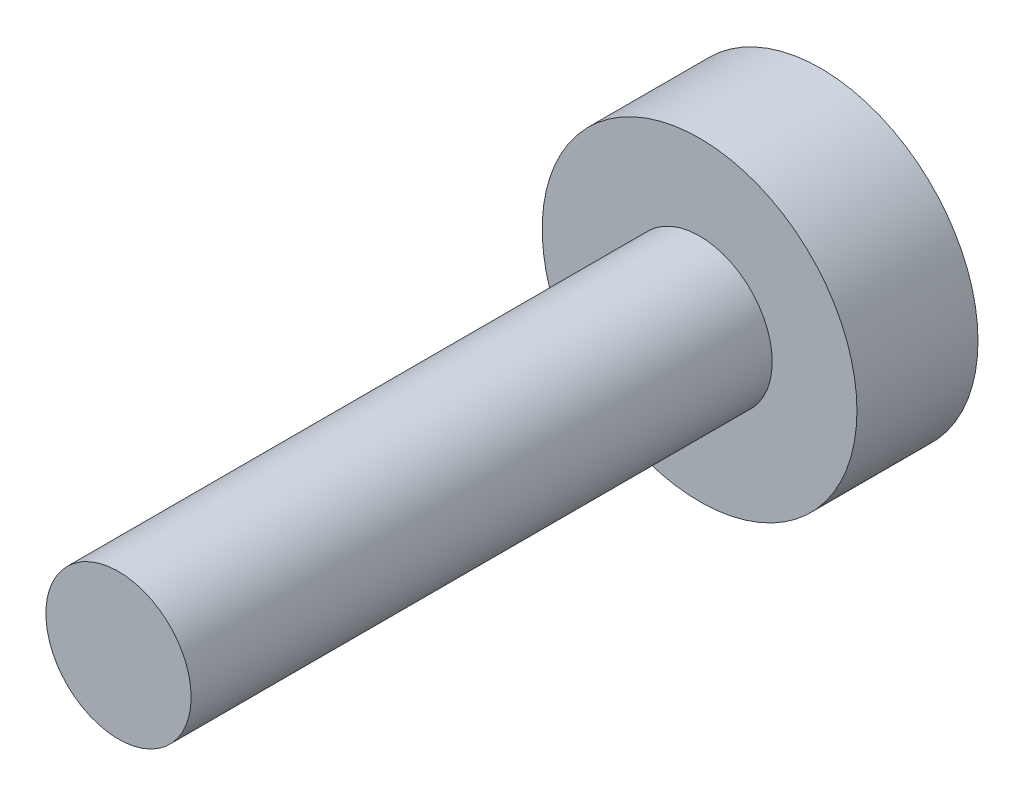
ISO-10303-21;
HEADER;
FILE_DESCRIPTION(('STEP AP214'),'2;1');
FILE_NAME('part.step','',(''),(''),'','','');
FILE_SCHEMA(('AUTOMOTIVE_DESIGN { 1 0 10303 214 1 1 1 1 }'));
ENDSEC;
DATA;
#1=APPLICATION_CONTEXT('core data for automotive mechanical design processes');
#2=APPLICATION_PROTOCOL_DEFINITION('international standard','automotive_design',2000,#1);
#3=PRODUCT_CONTEXT('',#1,'mechanical');
#4=PRODUCT('Part','Part','',(#3));
#5=PRODUCT_RELATED_PRODUCT_CATEGORY('part','',(#4));
#6=PRODUCT_DEFINITION_FORMATION('','',#4);
#7=PRODUCT_DEFINITION_CONTEXT('part definition',#1,'design');
#8=PRODUCT_DEFINITION('design','',#6,#7);
#9=PRODUCT_DEFINITION_SHAPE('','',#8);
#10=(LENGTH_UNIT() NAMED_UNIT(*) SI_UNIT(.MILLI.,.METRE.));
#11=(NAMED_UNIT(*) PLANE_ANGLE_UNIT() SI_UNIT($,.RADIAN.));
#12=(NAMED_UNIT(*) SI_UNIT($,.STERADIAN.) SOLID_ANGLE_UNIT());
#13=UNCERTAINTY_MEASURE_WITH_UNIT(LENGTH_MEASURE(1.E-05),#10,'distance_accuracy_value','');
#14=(GEOMETRIC_REPRESENTATION_CONTEXT(3) GLOBAL_UNCERTAINTY_ASSIGNED_CONTEXT((#13)) GLOBAL_UNIT_ASSIGNED_CONTEXT((#10,
#11,#12)) REPRESENTATION_CONTEXT('',''));
#15=CARTESIAN_POINT('',(0.,0.,0.));
#16=DIRECTION('',(0.,0.,1.));
#17=DIRECTION('',(1.,0.,0.));
#18=AXIS2_PLACEMENT_3D('',#15,#16,#17);
#19=CARTESIAN_POINT('',(184.61602540378,18.,79.));
#20=DIRECTION('',(0.,0.,1.));
#21=DIRECTION('',(1.,0.,0.));
#22=AXIS2_PLACEMENT_3D('',#19,#20,#21);
#23=PLANE('',#22);
#24=CARTESIAN_POINT('',(184.61602540378,18.,79.));
#25=DIRECTION('',(0.,0.,1.));
#26=DIRECTION('',(1.,0.,0.));
#27=AXIS2_PLACEMENT_3D('',#24,#25,#26);
#28=CIRCLE('',#27,1.5);
#29=CARTESIAN_POINT('',(186.11602540378,18.,79.));
#30=VERTEX_POINT('',#29);
#31=EDGE_CURVE('E25',#30,#30,#28,.T.);
#32=ORIENTED_EDGE('',*,*,#31,.T.);
#33=EDGE_LOOP('',(#32));
#34=FACE_BOUND('',#33,.T.);
#35=ADVANCED_FACE('F14',(#34),#23,.T.);
#36=CARTESIAN_POINT('',(184.61602540378,18.,67.));
#37=DIRECTION('',(0.,0.,1.));
#38=DIRECTION('',(1.,0.,0.));
#39=AXIS2_PLACEMENT_3D('',#36,#37,#38);
#40=CYLINDRICAL_SURFACE('',#39,1.5);
#41=ORIENTED_EDGE('',*,*,#31,.F.);
#42=DIRECTION('',(0.,0.,1.));
#43=VECTOR('',#42,1.);
#44=CARTESIAN_POINT('',(186.11602540378,18.,67.));
#45=LINE('',#44,#43);
#46=CARTESIAN_POINT('',(186.11602540378,18.,67.));
#47=VERTEX_POINT('',#46);
#48=EDGE_CURVE('E9',#47,#30,#45,.T.);
#49=ORIENTED_EDGE('',*,*,#48,.F.);
#50=CARTESIAN_POINT('',(184.61602540378,18.,67.));
#51=DIRECTION('',(0.,0.,1.));
#52=DIRECTION('',(1.,0.,0.));
#53=AXIS2_PLACEMENT_3D('',#50,#51,#52);
#54=CIRCLE('',#53,1.5);
#55=EDGE_CURVE('E18',#47,#47,#54,.T.);
#56=ORIENTED_EDGE('',*,*,#55,.T.);
#57=ORIENTED_EDGE('',*,*,#48,.T.);
#58=EDGE_LOOP('',(#41,#49,#56,#57));
#59=FACE_BOUND('',#58,.T.);
#60=ADVANCED_FACE('F73',(#59),#40,.T.);
#61=CARTESIAN_POINT('',(184.61602540378,18.,64.5));
#62=DIRECTION('',(0.,0.,1.));
#63=DIRECTION('',(1.,0.,0.));
#64=AXIS2_PLACEMENT_3D('',#61,#62,#63);
#65=PLANE('',#64);
#66=CARTESIAN_POINT('',(184.61602540378,18.,64.5));
#67=DIRECTION('',(0.,0.,1.));
#68=DIRECTION('',(1.,0.,0.));
#69=AXIS2_PLACEMENT_3D('',#66,#67,#68);
#70=CIRCLE('',#69,3.25);
#71=CARTESIAN_POINT('',(187.86602540378,18.,64.5));
#72=VERTEX_POINT('',#71);
#73=EDGE_CURVE('E54',#72,#72,#70,.T.);
#74=ORIENTED_EDGE('',*,*,#73,.F.);
#75=EDGE_LOOP('',(#74));
#76=FACE_BOUND('',#75,.T.);
#77=ADVANCED_FACE('F16',(#76),#65,.F.);
#78=CARTESIAN_POINT('',(184.61602540378,18.,67.));
#79=DIRECTION('',(0.,0.,1.));
#80=DIRECTION('',(1.,0.,0.));
#81=AXIS2_PLACEMENT_3D('',#78,#79,#80);
#82=PLANE('',#81);
#83=ORIENTED_EDGE('',*,*,#55,.F.);
#84=EDGE_LOOP('',(#83));
#85=FACE_BOUND('',#84,.T.);
#86=CARTESIAN_POINT('',(184.61602540378,18.,67.));
#87=DIRECTION('',(0.,0.,1.));
#88=DIRECTION('',(1.,0.,0.));
#89=AXIS2_PLACEMENT_3D('',#86,#87,#88);
#90=CIRCLE('',#89,3.25);
#91=CARTESIAN_POINT('',(187.86602540378,18.,67.));
#92=VERTEX_POINT('',#91);
#93=EDGE_CURVE('E52',#92,#92,#90,.T.);
#94=ORIENTED_EDGE('',*,*,#93,.T.);
#95=EDGE_LOOP('',(#94));
#96=FACE_BOUND('',#95,.T.);
#97=ADVANCED_FACE('F58',(#85,#96),#82,.T.);
#98=CARTESIAN_POINT('',(184.61602540378,18.,64.5));
#99=DIRECTION('',(0.,0.,1.));
#100=DIRECTION('',(1.,0.,0.));
#101=AXIS2_PLACEMENT_3D('',#98,#99,#100);
#102=CYLINDRICAL_SURFACE('',#101,3.25);
#103=ORIENTED_EDGE('',*,*,#93,.F.);
#104=DIRECTION('',(0.,0.,1.));
#105=VECTOR('',#104,1.);
#106=CARTESIAN_POINT('',(187.86602540378,18.,64.5));
#107=LINE('',#106,#105);
#108=EDGE_CURVE('E49',#72,#92,#107,.T.);
#109=ORIENTED_EDGE('',*,*,#108,.F.);
#110=ORIENTED_EDGE('',*,*,#73,.T.);
#111=ORIENTED_EDGE('',*,*,#108,.T.);
#112=EDGE_LOOP('',(#103,#109,#110,#111));
#113=FACE_BOUND('',#112,.T.);
#114=ADVANCED_FACE('F51',(#113),#102,.T.);
#115=CLOSED_SHELL('',(#35,#60,#77,#97,#114));
#116=MANIFOLD_SOLID_BREP('B1',#115);
#117=ADVANCED_BREP_SHAPE_REPRESENTATION('',(#18,#116),#14);
#118=SHAPE_DEFINITION_REPRESENTATION(#9,#117);
ENDSEC;
END-ISO-10303-21;
